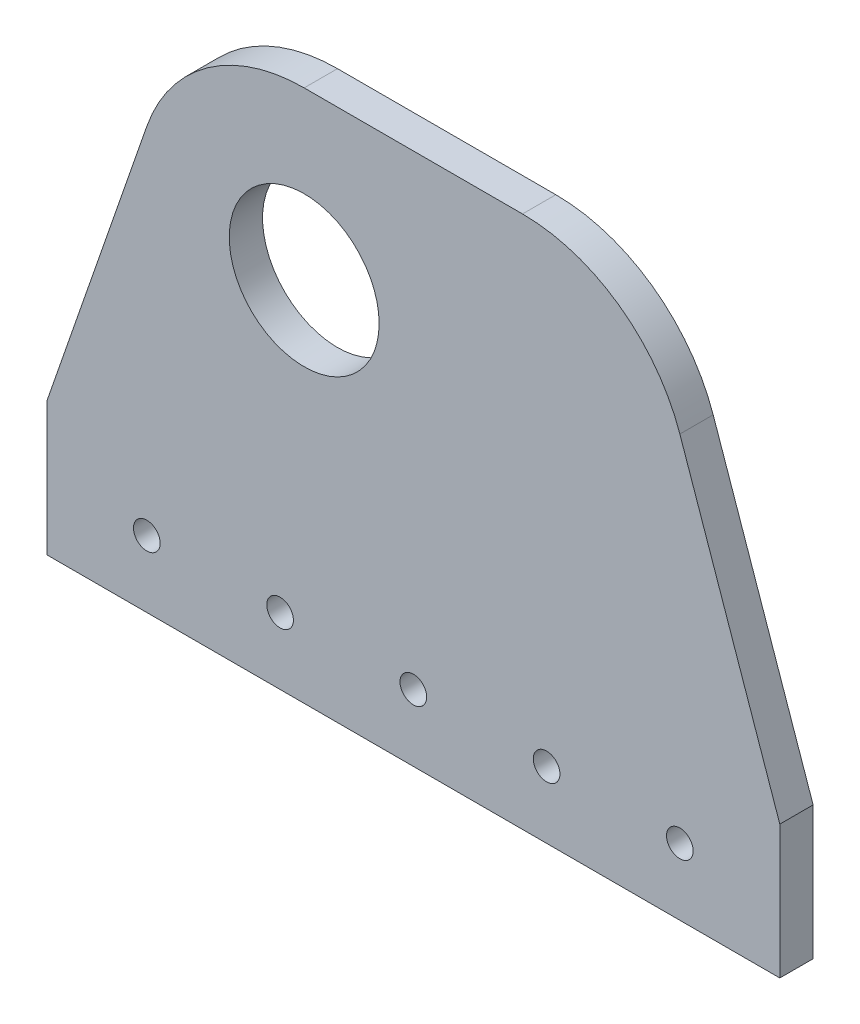
ISO-10303-21;
HEADER;
FILE_DESCRIPTION(('STEP AP214'),'2;1');
FILE_NAME('part.step','',(''),(''),'','','');
FILE_SCHEMA(('AUTOMOTIVE_DESIGN { 1 0 10303 214 1 1 1 1 }'));
ENDSEC;
DATA;
#1=APPLICATION_CONTEXT('core data for automotive mechanical design processes');
#2=APPLICATION_PROTOCOL_DEFINITION('international standard','automotive_design',2000,#1);
#3=PRODUCT_CONTEXT('',#1,'mechanical');
#4=PRODUCT('Part','Part','',(#3));
#5=PRODUCT_RELATED_PRODUCT_CATEGORY('part','',(#4));
#6=PRODUCT_DEFINITION_FORMATION('','',#4);
#7=PRODUCT_DEFINITION_CONTEXT('part definition',#1,'design');
#8=PRODUCT_DEFINITION('design','',#6,#7);
#9=PRODUCT_DEFINITION_SHAPE('','',#8);
#10=(LENGTH_UNIT() NAMED_UNIT(*) SI_UNIT(.MILLI.,.METRE.));
#11=(NAMED_UNIT(*) PLANE_ANGLE_UNIT() SI_UNIT($,.RADIAN.));
#12=(NAMED_UNIT(*) SI_UNIT($,.STERADIAN.) SOLID_ANGLE_UNIT());
#13=UNCERTAINTY_MEASURE_WITH_UNIT(LENGTH_MEASURE(1.E-05),#10,'distance_accuracy_value','');
#14=(GEOMETRIC_REPRESENTATION_CONTEXT(3) GLOBAL_UNCERTAINTY_ASSIGNED_CONTEXT((#13)) GLOBAL_UNIT_ASSIGNED_CONTEXT((#10,
#11,#12)) REPRESENTATION_CONTEXT('',''));
#15=CARTESIAN_POINT('',(0.,0.,0.));
#16=DIRECTION('',(0.,0.,1.));
#17=DIRECTION('',(1.,0.,0.));
#18=AXIS2_PLACEMENT_3D('',#15,#16,#17);
#19=CARTESIAN_POINT('',(49.0434075063098,69.85,6.35));
#20=DIRECTION('',(0.,0.,1.));
#21=DIRECTION('',(1.,0.,0.));
#22=AXIS2_PLACEMENT_3D('',#19,#20,#21);
#23=PLANE('',#22);
#24=CARTESIAN_POINT('',(44.45,12.6999999999998,6.35));
#25=DIRECTION('',(0.,0.,1.));
#26=DIRECTION('',(1.,0.,0.));
#27=AXIS2_PLACEMENT_3D('',#24,#25,#26);
#28=CIRCLE('',#27,2.54);
#29=CARTESIAN_POINT('',(46.99,12.6999999999998,6.35));
#30=VERTEX_POINT('',#29);
#31=EDGE_CURVE('E203',#30,#30,#28,.T.);
#32=ORIENTED_EDGE('',*,*,#31,.F.);
#33=EDGE_LOOP('',(#32));
#34=FACE_BOUND('',#33,.T.);
#35=CARTESIAN_POINT('',(95.25,12.7,6.35));
#36=DIRECTION('',(0.,0.,1.));
#37=DIRECTION('',(1.,0.,0.));
#38=AXIS2_PLACEMENT_3D('',#35,#36,#37);
#39=CIRCLE('',#38,2.53999999999998);
#40=CARTESIAN_POINT('',(97.79,12.7,6.35));
#41=VERTEX_POINT('',#40);
#42=EDGE_CURVE('E191',#41,#41,#39,.T.);
#43=ORIENTED_EDGE('',*,*,#42,.F.);
#44=EDGE_LOOP('',(#43));
#45=FACE_BOUND('',#44,.T.);
#46=CARTESIAN_POINT('',(49.0434075063098,69.85,6.35));
#47=DIRECTION('',(0.,0.,1.));
#48=DIRECTION('',(1.,0.,0.));
#49=AXIS2_PLACEMENT_3D('',#46,#47,#48);
#50=CIRCLE('',#49,14.2875);
#51=CARTESIAN_POINT('',(63.3309075063098,69.85,6.35));
#52=VERTEX_POINT('',#51);
#53=EDGE_CURVE('E137',#52,#52,#50,.T.);
#54=ORIENTED_EDGE('',*,*,#53,.F.);
#55=EDGE_LOOP('',(#54));
#56=FACE_BOUND('',#55,.T.);
#57=DIRECTION('',(0.,-1.,0.));
#58=VECTOR('',#57,1.);
#59=CARTESIAN_POINT('',(0.,0.,6.35));
#60=LINE('',#59,#58);
#61=CARTESIAN_POINT('',(0.,25.4,6.35));
#62=VERTEX_POINT('',#61);
#63=CARTESIAN_POINT('',(0.,0.,6.35));
#64=VERTEX_POINT('',#63);
#65=EDGE_CURVE('E148',#62,#64,#60,.T.);
#66=ORIENTED_EDGE('',*,*,#65,.T.);
#67=DIRECTION('',(1.,0.,0.));
#68=VECTOR('',#67,1.);
#69=CARTESIAN_POINT('',(139.7,0.,6.35));
#70=LINE('',#69,#68);
#71=CARTESIAN_POINT('',(139.7,0.,6.35));
#72=VERTEX_POINT('',#71);
#73=EDGE_CURVE('E96',#64,#72,#70,.T.);
#74=ORIENTED_EDGE('',*,*,#73,.T.);
#75=DIRECTION('',(0.,1.,0.));
#76=VECTOR('',#75,1.);
#77=CARTESIAN_POINT('',(139.7,25.4,6.35));
#78=LINE('',#77,#76);
#79=CARTESIAN_POINT('',(139.7,25.4,6.35));
#80=VERTEX_POINT('',#79);
#81=EDGE_CURVE('E163',#72,#80,#78,.T.);
#82=ORIENTED_EDGE('',*,*,#81,.T.);
#83=DIRECTION('',(-0.328009995720053,0.944674252167238,0.));
#84=VECTOR('',#83,1.);
#85=CARTESIAN_POINT('',(120.65,80.2643173641117,6.35));
#86=LINE('',#85,#84);
#87=CARTESIAN_POINT('',(120.65,80.2643173641117,6.35));
#88=VERTEX_POINT('',#87);
#89=EDGE_CURVE('E176',#80,#88,#86,.T.);
#90=ORIENTED_EDGE('',*,*,#89,.T.);
#91=CARTESIAN_POINT('',(90.6565924936902,69.85,6.35));
#92=DIRECTION('',(0.,0.,1.));
#93=DIRECTION('',(1.,0.,0.));
#94=AXIS2_PLACEMENT_3D('',#91,#92,#93);
#95=CIRCLE('',#94,31.75);
#96=CARTESIAN_POINT('',(90.6565924936902,101.6,6.35));
#97=VERTEX_POINT('',#96);
#98=EDGE_CURVE('E115',#88,#97,#95,.T.);
#99=ORIENTED_EDGE('',*,*,#98,.T.);
#100=DIRECTION('',(-1.,0.,0.));
#101=VECTOR('',#100,1.);
#102=CARTESIAN_POINT('',(49.0434075063098,101.6,6.35));
#103=LINE('',#102,#101);
#104=CARTESIAN_POINT('',(49.0434075063098,101.6,6.35));
#105=VERTEX_POINT('',#104);
#106=EDGE_CURVE('E109',#97,#105,#103,.T.);
#107=ORIENTED_EDGE('',*,*,#106,.T.);
#108=CARTESIAN_POINT('',(49.0434075063098,69.85,6.35));
#109=DIRECTION('',(0.,0.,1.));
#110=DIRECTION('',(1.,0.,0.));
#111=AXIS2_PLACEMENT_3D('',#108,#109,#110);
#112=CIRCLE('',#111,31.75);
#113=CARTESIAN_POINT('',(19.05,80.2643173641117,6.35));
#114=VERTEX_POINT('',#113);
#115=EDGE_CURVE('E113',#105,#114,#112,.T.);
#116=ORIENTED_EDGE('',*,*,#115,.T.);
#117=DIRECTION('',(-0.328009995720053,-0.944674252167238,0.));
#118=VECTOR('',#117,1.);
#119=CARTESIAN_POINT('',(0.,25.4,6.35));
#120=LINE('',#119,#118);
#121=EDGE_CURVE('E53',#114,#62,#120,.T.);
#122=ORIENTED_EDGE('',*,*,#121,.T.);
#123=EDGE_LOOP('',(#66,#74,#82,#90,#99,#107,#116,#122));
#124=FACE_BOUND('',#123,.T.);
#125=CARTESIAN_POINT('',(69.85,12.7,6.35));
#126=DIRECTION('',(0.,0.,1.));
#127=DIRECTION('',(1.,0.,0.));
#128=AXIS2_PLACEMENT_3D('',#125,#126,#127);
#129=CIRCLE('',#128,2.54);
#130=CARTESIAN_POINT('',(72.39,12.7,6.35));
#131=VERTEX_POINT('',#130);
#132=EDGE_CURVE('E185',#131,#131,#129,.T.);
#133=ORIENTED_EDGE('',*,*,#132,.F.);
#134=EDGE_LOOP('',(#133));
#135=FACE_BOUND('',#134,.T.);
#136=CARTESIAN_POINT('',(120.65,12.7,6.35));
#137=DIRECTION('',(0.,0.,1.));
#138=DIRECTION('',(1.,0.,0.));
#139=AXIS2_PLACEMENT_3D('',#136,#137,#138);
#140=CIRCLE('',#139,2.54);
#141=CARTESIAN_POINT('',(123.19,12.7,6.35));
#142=VERTEX_POINT('',#141);
#143=EDGE_CURVE('E197',#142,#142,#140,.T.);
#144=ORIENTED_EDGE('',*,*,#143,.F.);
#145=EDGE_LOOP('',(#144));
#146=FACE_BOUND('',#145,.T.);
#147=CARTESIAN_POINT('',(19.05,12.6999999999996,6.35));
#148=DIRECTION('',(0.,0.,1.));
#149=DIRECTION('',(1.,0.,0.));
#150=AXIS2_PLACEMENT_3D('',#147,#148,#149);
#151=CIRCLE('',#150,2.54);
#152=CARTESIAN_POINT('',(21.59,12.6999999999996,6.35));
#153=VERTEX_POINT('',#152);
#154=EDGE_CURVE('E209',#153,#153,#151,.T.);
#155=ORIENTED_EDGE('',*,*,#154,.F.);
#156=EDGE_LOOP('',(#155));
#157=FACE_BOUND('',#156,.T.);
#158=ADVANCED_FACE('F36',(#34,#45,#56,#124,#135,#146,#157),#23,.T.);
#159=CARTESIAN_POINT('',(49.0434075063098,69.85,0.));
#160=DIRECTION('',(0.,0.,1.));
#161=DIRECTION('',(1.,0.,0.));
#162=AXIS2_PLACEMENT_3D('',#159,#160,#161);
#163=PLANE('',#162);
#164=DIRECTION('',(0.,-1.,0.));
#165=VECTOR('',#164,1.);
#166=CARTESIAN_POINT('',(0.,0.,0.));
#167=LINE('',#166,#165);
#168=CARTESIAN_POINT('',(0.,25.4,0.));
#169=VERTEX_POINT('',#168);
#170=CARTESIAN_POINT('',(0.,0.,0.));
#171=VERTEX_POINT('',#170);
#172=EDGE_CURVE('E133',#169,#171,#167,.T.);
#173=ORIENTED_EDGE('',*,*,#172,.F.);
#174=DIRECTION('',(-0.328009995720053,-0.944674252167238,0.));
#175=VECTOR('',#174,1.);
#176=CARTESIAN_POINT('',(0.,25.4,0.));
#177=LINE('',#176,#175);
#178=CARTESIAN_POINT('',(19.05,80.2643173641117,0.));
#179=VERTEX_POINT('',#178);
#180=EDGE_CURVE('E88',#179,#169,#177,.T.);
#181=ORIENTED_EDGE('',*,*,#180,.F.);
#182=CARTESIAN_POINT('',(49.0434075063098,69.85,0.));
#183=DIRECTION('',(0.,0.,1.));
#184=DIRECTION('',(1.,0.,0.));
#185=AXIS2_PLACEMENT_3D('',#182,#183,#184);
#186=CIRCLE('',#185,31.75);
#187=CARTESIAN_POINT('',(49.0434075063098,101.6,0.));
#188=VERTEX_POINT('',#187);
#189=EDGE_CURVE('E82',#188,#179,#186,.T.);
#190=ORIENTED_EDGE('',*,*,#189,.F.);
#191=DIRECTION('',(-1.,0.,0.));
#192=VECTOR('',#191,1.);
#193=CARTESIAN_POINT('',(49.0434075063098,101.6,0.));
#194=LINE('',#193,#192);
#195=CARTESIAN_POINT('',(90.6565924936902,101.6,0.));
#196=VERTEX_POINT('',#195);
#197=EDGE_CURVE('E123',#196,#188,#194,.T.);
#198=ORIENTED_EDGE('',*,*,#197,.F.);
#199=CARTESIAN_POINT('',(90.6565924936902,69.85,0.));
#200=DIRECTION('',(0.,0.,1.));
#201=DIRECTION('',(1.,0.,0.));
#202=AXIS2_PLACEMENT_3D('',#199,#200,#201);
#203=CIRCLE('',#202,31.75);
#204=CARTESIAN_POINT('',(120.65,80.2643173641117,0.));
#205=VERTEX_POINT('',#204);
#206=EDGE_CURVE('E143',#205,#196,#203,.T.);
#207=ORIENTED_EDGE('',*,*,#206,.F.);
#208=DIRECTION('',(-0.328009995720053,0.944674252167238,0.));
#209=VECTOR('',#208,1.);
#210=CARTESIAN_POINT('',(120.65,80.2643173641117,0.));
#211=LINE('',#210,#209);
#212=CARTESIAN_POINT('',(139.7,25.4,0.));
#213=VERTEX_POINT('',#212);
#214=EDGE_CURVE('E141',#213,#205,#211,.T.);
#215=ORIENTED_EDGE('',*,*,#214,.F.);
#216=DIRECTION('',(0.,1.,0.));
#217=VECTOR('',#216,1.);
#218=CARTESIAN_POINT('',(139.7,25.4,0.));
#219=LINE('',#218,#217);
#220=CARTESIAN_POINT('',(139.7,0.,0.));
#221=VERTEX_POINT('',#220);
#222=EDGE_CURVE('E139',#221,#213,#219,.T.);
#223=ORIENTED_EDGE('',*,*,#222,.F.);
#224=DIRECTION('',(1.,0.,0.));
#225=VECTOR('',#224,1.);
#226=CARTESIAN_POINT('',(139.7,0.,0.));
#227=LINE('',#226,#225);
#228=EDGE_CURVE('E136',#171,#221,#227,.T.);
#229=ORIENTED_EDGE('',*,*,#228,.F.);
#230=EDGE_LOOP('',(#173,#181,#190,#198,#207,#215,#223,#229));
#231=FACE_BOUND('',#230,.T.);
#232=CARTESIAN_POINT('',(49.0434075063098,69.85,0.));
#233=DIRECTION('',(0.,0.,1.));
#234=DIRECTION('',(1.,0.,0.));
#235=AXIS2_PLACEMENT_3D('',#232,#233,#234);
#236=CIRCLE('',#235,14.2875);
#237=CARTESIAN_POINT('',(63.3309075063098,69.85,0.));
#238=VERTEX_POINT('',#237);
#239=EDGE_CURVE('E182',#238,#238,#236,.T.);
#240=ORIENTED_EDGE('',*,*,#239,.T.);
#241=EDGE_LOOP('',(#240));
#242=FACE_BOUND('',#241,.T.);
#243=CARTESIAN_POINT('',(69.85,12.7,0.));
#244=DIRECTION('',(0.,0.,1.));
#245=DIRECTION('',(1.,0.,0.));
#246=AXIS2_PLACEMENT_3D('',#243,#244,#245);
#247=CIRCLE('',#246,2.54);
#248=CARTESIAN_POINT('',(72.39,12.7,0.));
#249=VERTEX_POINT('',#248);
#250=EDGE_CURVE('E188',#249,#249,#247,.T.);
#251=ORIENTED_EDGE('',*,*,#250,.T.);
#252=EDGE_LOOP('',(#251));
#253=FACE_BOUND('',#252,.T.);
#254=CARTESIAN_POINT('',(95.25,12.7,0.));
#255=DIRECTION('',(0.,0.,1.));
#256=DIRECTION('',(1.,0.,0.));
#257=AXIS2_PLACEMENT_3D('',#254,#255,#256);
#258=CIRCLE('',#257,2.53999999999998);
#259=CARTESIAN_POINT('',(97.79,12.7,0.));
#260=VERTEX_POINT('',#259);
#261=EDGE_CURVE('E194',#260,#260,#258,.T.);
#262=ORIENTED_EDGE('',*,*,#261,.T.);
#263=EDGE_LOOP('',(#262));
#264=FACE_BOUND('',#263,.T.);
#265=CARTESIAN_POINT('',(120.65,12.7,0.));
#266=DIRECTION('',(0.,0.,1.));
#267=DIRECTION('',(1.,0.,0.));
#268=AXIS2_PLACEMENT_3D('',#265,#266,#267);
#269=CIRCLE('',#268,2.54);
#270=CARTESIAN_POINT('',(123.19,12.7,0.));
#271=VERTEX_POINT('',#270);
#272=EDGE_CURVE('E200',#271,#271,#269,.T.);
#273=ORIENTED_EDGE('',*,*,#272,.T.);
#274=EDGE_LOOP('',(#273));
#275=FACE_BOUND('',#274,.T.);
#276=CARTESIAN_POINT('',(44.45,12.6999999999998,0.));
#277=DIRECTION('',(0.,0.,1.));
#278=DIRECTION('',(1.,0.,0.));
#279=AXIS2_PLACEMENT_3D('',#276,#277,#278);
#280=CIRCLE('',#279,2.54);
#281=CARTESIAN_POINT('',(46.99,12.6999999999998,0.));
#282=VERTEX_POINT('',#281);
#283=EDGE_CURVE('E206',#282,#282,#280,.T.);
#284=ORIENTED_EDGE('',*,*,#283,.T.);
#285=EDGE_LOOP('',(#284));
#286=FACE_BOUND('',#285,.T.);
#287=CARTESIAN_POINT('',(19.05,12.6999999999996,0.));
#288=DIRECTION('',(0.,0.,1.));
#289=DIRECTION('',(1.,0.,0.));
#290=AXIS2_PLACEMENT_3D('',#287,#288,#289);
#291=CIRCLE('',#290,2.54);
#292=CARTESIAN_POINT('',(21.59,12.6999999999996,0.));
#293=VERTEX_POINT('',#292);
#294=EDGE_CURVE('E212',#293,#293,#291,.T.);
#295=ORIENTED_EDGE('',*,*,#294,.T.);
#296=EDGE_LOOP('',(#295));
#297=FACE_BOUND('',#296,.T.);
#298=ADVANCED_FACE('F167',(#231,#242,#253,#264,#275,#286,#297),#163,.F.);
#299=CARTESIAN_POINT('',(0.,0.,6.35));
#300=DIRECTION('',(1.,0.,0.));
#301=DIRECTION('',(0.,0.,-1.));
#302=AXIS2_PLACEMENT_3D('',#299,#300,#301);
#303=PLANE('',#302);
#304=ORIENTED_EDGE('',*,*,#172,.T.);
#305=DIRECTION('',(0.,0.,-1.));
#306=VECTOR('',#305,1.);
#307=CARTESIAN_POINT('',(0.,0.,6.35));
#308=LINE('',#307,#306);
#309=EDGE_CURVE('E11',#64,#171,#308,.T.);
#310=ORIENTED_EDGE('',*,*,#309,.F.);
#311=ORIENTED_EDGE('',*,*,#65,.F.);
#312=DIRECTION('',(0.,0.,-1.));
#313=VECTOR('',#312,1.);
#314=CARTESIAN_POINT('',(0.,25.4,6.35));
#315=LINE('',#314,#313);
#316=EDGE_CURVE('E129',#62,#169,#315,.T.);
#317=ORIENTED_EDGE('',*,*,#316,.T.);
#318=EDGE_LOOP('',(#304,#310,#311,#317));
#319=FACE_BOUND('',#318,.T.);
#320=ADVANCED_FACE('F38',(#319),#303,.F.);
#321=CARTESIAN_POINT('',(139.7,0.,6.35));
#322=DIRECTION('',(0.,1.,0.));
#323=DIRECTION('',(-1.,0.,0.));
#324=AXIS2_PLACEMENT_3D('',#321,#322,#323);
#325=PLANE('',#324);
#326=ORIENTED_EDGE('',*,*,#228,.T.);
#327=DIRECTION('',(0.,0.,-1.));
#328=VECTOR('',#327,1.);
#329=CARTESIAN_POINT('',(139.7,0.,6.35));
#330=LINE('',#329,#328);
#331=EDGE_CURVE('E45',#72,#221,#330,.T.);
#332=ORIENTED_EDGE('',*,*,#331,.F.);
#333=ORIENTED_EDGE('',*,*,#73,.F.);
#334=ORIENTED_EDGE('',*,*,#309,.T.);
#335=EDGE_LOOP('',(#326,#332,#333,#334));
#336=FACE_BOUND('',#335,.T.);
#337=ADVANCED_FACE('F246',(#336),#325,.F.);
#338=CARTESIAN_POINT('',(139.7,25.4,6.35));
#339=DIRECTION('',(-1.,0.,0.));
#340=DIRECTION('',(0.,0.,1.));
#341=AXIS2_PLACEMENT_3D('',#338,#339,#340);
#342=PLANE('',#341);
#343=ORIENTED_EDGE('',*,*,#222,.T.);
#344=DIRECTION('',(0.,0.,-1.));
#345=VECTOR('',#344,1.);
#346=CARTESIAN_POINT('',(139.7,25.4,6.35));
#347=LINE('',#346,#345);
#348=EDGE_CURVE('E155',#80,#213,#347,.T.);
#349=ORIENTED_EDGE('',*,*,#348,.F.);
#350=ORIENTED_EDGE('',*,*,#81,.F.);
#351=ORIENTED_EDGE('',*,*,#331,.T.);
#352=EDGE_LOOP('',(#343,#349,#350,#351));
#353=FACE_BOUND('',#352,.T.);
#354=ADVANCED_FACE('F161',(#353),#342,.F.);
#355=CARTESIAN_POINT('',(120.65,80.2643173641117,6.35));
#356=DIRECTION('',(-0.944674252167238,-0.328009995720053,0.));
#357=DIRECTION('',(0.328009995720053,-0.944674252167238,0.));
#358=AXIS2_PLACEMENT_3D('',#355,#356,#357);
#359=PLANE('',#358);
#360=ORIENTED_EDGE('',*,*,#214,.T.);
#361=DIRECTION('',(0.,0.,-1.));
#362=VECTOR('',#361,1.);
#363=CARTESIAN_POINT('',(120.65,80.2643173641117,6.35));
#364=LINE('',#363,#362);
#365=EDGE_CURVE('E152',#88,#205,#364,.T.);
#366=ORIENTED_EDGE('',*,*,#365,.F.);
#367=ORIENTED_EDGE('',*,*,#89,.F.);
#368=ORIENTED_EDGE('',*,*,#348,.T.);
#369=EDGE_LOOP('',(#360,#366,#367,#368));
#370=FACE_BOUND('',#369,.T.);
#371=ADVANCED_FACE('F172',(#370),#359,.F.);
#372=CARTESIAN_POINT('',(90.6565924936902,69.85,6.35));
#373=DIRECTION('',(0.,0.,-1.));
#374=DIRECTION('',(-1.,0.,0.));
#375=AXIS2_PLACEMENT_3D('',#372,#373,#374);
#376=CYLINDRICAL_SURFACE('',#375,31.75);
#377=ORIENTED_EDGE('',*,*,#206,.T.);
#378=DIRECTION('',(0.,0.,-1.));
#379=VECTOR('',#378,1.);
#380=CARTESIAN_POINT('',(90.6565924936902,101.6,6.35));
#381=LINE('',#380,#379);
#382=EDGE_CURVE('E124',#97,#196,#381,.T.);
#383=ORIENTED_EDGE('',*,*,#382,.F.);
#384=ORIENTED_EDGE('',*,*,#98,.F.);
#385=ORIENTED_EDGE('',*,*,#365,.T.);
#386=EDGE_LOOP('',(#377,#383,#384,#385));
#387=FACE_BOUND('',#386,.T.);
#388=ADVANCED_FACE('F175',(#387),#376,.T.);
#389=CARTESIAN_POINT('',(49.0434075063098,101.6,6.35));
#390=DIRECTION('',(0.,-1.,0.));
#391=DIRECTION('',(1.,0.,0.));
#392=AXIS2_PLACEMENT_3D('',#389,#390,#391);
#393=PLANE('',#392);
#394=ORIENTED_EDGE('',*,*,#197,.T.);
#395=DIRECTION('',(0.,0.,-1.));
#396=VECTOR('',#395,1.);
#397=CARTESIAN_POINT('',(49.0434075063098,101.6,6.35));
#398=LINE('',#397,#396);
#399=EDGE_CURVE('E120',#105,#188,#398,.T.);
#400=ORIENTED_EDGE('',*,*,#399,.F.);
#401=ORIENTED_EDGE('',*,*,#106,.F.);
#402=ORIENTED_EDGE('',*,*,#382,.T.);
#403=EDGE_LOOP('',(#394,#400,#401,#402));
#404=FACE_BOUND('',#403,.T.);
#405=ADVANCED_FACE('F121',(#404),#393,.F.);
#406=CARTESIAN_POINT('',(49.0434075063098,69.85,6.35));
#407=DIRECTION('',(0.,0.,-1.));
#408=DIRECTION('',(-1.,0.,0.));
#409=AXIS2_PLACEMENT_3D('',#406,#407,#408);
#410=CYLINDRICAL_SURFACE('',#409,31.75);
#411=ORIENTED_EDGE('',*,*,#189,.T.);
#412=DIRECTION('',(0.,0.,-1.));
#413=VECTOR('',#412,1.);
#414=CARTESIAN_POINT('',(19.05,80.2643173641117,6.35));
#415=LINE('',#414,#413);
#416=EDGE_CURVE('E125',#114,#179,#415,.T.);
#417=ORIENTED_EDGE('',*,*,#416,.F.);
#418=ORIENTED_EDGE('',*,*,#115,.F.);
#419=ORIENTED_EDGE('',*,*,#399,.T.);
#420=EDGE_LOOP('',(#411,#417,#418,#419));
#421=FACE_BOUND('',#420,.T.);
#422=ADVANCED_FACE('F127',(#421),#410,.T.);
#423=CARTESIAN_POINT('',(0.,25.4,6.35));
#424=DIRECTION('',(0.944674252167238,-0.328009995720053,0.));
#425=DIRECTION('',(0.328009995720053,0.944674252167238,0.));
#426=AXIS2_PLACEMENT_3D('',#423,#424,#425);
#427=PLANE('',#426);
#428=ORIENTED_EDGE('',*,*,#180,.T.);
#429=ORIENTED_EDGE('',*,*,#316,.F.);
#430=ORIENTED_EDGE('',*,*,#121,.F.);
#431=ORIENTED_EDGE('',*,*,#416,.T.);
#432=EDGE_LOOP('',(#428,#429,#430,#431));
#433=FACE_BOUND('',#432,.T.);
#434=ADVANCED_FACE('F234',(#433),#427,.F.);
#435=CARTESIAN_POINT('',(49.0434075063098,69.85,6.35));
#436=DIRECTION('',(0.,0.,-1.));
#437=DIRECTION('',(-1.,0.,0.));
#438=AXIS2_PLACEMENT_3D('',#435,#436,#437);
#439=CYLINDRICAL_SURFACE('',#438,14.2875);
#440=ORIENTED_EDGE('',*,*,#53,.T.);
#441=EDGE_LOOP('',(#440));
#442=FACE_BOUND('',#441,.T.);
#443=ORIENTED_EDGE('',*,*,#239,.F.);
#444=EDGE_LOOP('',(#443));
#445=FACE_BOUND('',#444,.T.);
#446=ADVANCED_FACE('F231',(#442,#445),#439,.F.);
#447=CARTESIAN_POINT('',(69.85,12.7,6.35));
#448=DIRECTION('',(0.,0.,-1.));
#449=DIRECTION('',(-1.,0.,0.));
#450=AXIS2_PLACEMENT_3D('',#447,#448,#449);
#451=CYLINDRICAL_SURFACE('',#450,2.54);
#452=ORIENTED_EDGE('',*,*,#132,.T.);
#453=EDGE_LOOP('',(#452));
#454=FACE_BOUND('',#453,.T.);
#455=ORIENTED_EDGE('',*,*,#250,.F.);
#456=EDGE_LOOP('',(#455));
#457=FACE_BOUND('',#456,.T.);
#458=ADVANCED_FACE('F310',(#454,#457),#451,.F.);
#459=CARTESIAN_POINT('',(95.25,12.7,6.35));
#460=DIRECTION('',(0.,0.,-1.));
#461=DIRECTION('',(-1.,0.,0.));
#462=AXIS2_PLACEMENT_3D('',#459,#460,#461);
#463=CYLINDRICAL_SURFACE('',#462,2.53999999999998);
#464=ORIENTED_EDGE('',*,*,#42,.T.);
#465=EDGE_LOOP('',(#464));
#466=FACE_BOUND('',#465,.T.);
#467=ORIENTED_EDGE('',*,*,#261,.F.);
#468=EDGE_LOOP('',(#467));
#469=FACE_BOUND('',#468,.T.);
#470=ADVANCED_FACE('F318',(#466,#469),#463,.F.);
#471=CARTESIAN_POINT('',(120.65,12.7,6.35));
#472=DIRECTION('',(0.,0.,-1.));
#473=DIRECTION('',(-1.,0.,0.));
#474=AXIS2_PLACEMENT_3D('',#471,#472,#473);
#475=CYLINDRICAL_SURFACE('',#474,2.54);
#476=ORIENTED_EDGE('',*,*,#143,.T.);
#477=EDGE_LOOP('',(#476));
#478=FACE_BOUND('',#477,.T.);
#479=ORIENTED_EDGE('',*,*,#272,.F.);
#480=EDGE_LOOP('',(#479));
#481=FACE_BOUND('',#480,.T.);
#482=ADVANCED_FACE('F326',(#478,#481),#475,.F.);
#483=CARTESIAN_POINT('',(44.45,12.6999999999998,6.35));
#484=DIRECTION('',(0.,0.,-1.));
#485=DIRECTION('',(-1.,0.,0.));
#486=AXIS2_PLACEMENT_3D('',#483,#484,#485);
#487=CYLINDRICAL_SURFACE('',#486,2.54);
#488=ORIENTED_EDGE('',*,*,#31,.T.);
#489=EDGE_LOOP('',(#488));
#490=FACE_BOUND('',#489,.T.);
#491=ORIENTED_EDGE('',*,*,#283,.F.);
#492=EDGE_LOOP('',(#491));
#493=FACE_BOUND('',#492,.T.);
#494=ADVANCED_FACE('F335',(#490,#493),#487,.F.);
#495=CARTESIAN_POINT('',(19.05,12.6999999999996,6.35));
#496=DIRECTION('',(0.,0.,-1.));
#497=DIRECTION('',(-1.,0.,0.));
#498=AXIS2_PLACEMENT_3D('',#495,#496,#497);
#499=CYLINDRICAL_SURFACE('',#498,2.54);
#500=ORIENTED_EDGE('',*,*,#154,.T.);
#501=EDGE_LOOP('',(#500));
#502=FACE_BOUND('',#501,.T.);
#503=ORIENTED_EDGE('',*,*,#294,.F.);
#504=EDGE_LOOP('',(#503));
#505=FACE_BOUND('',#504,.T.);
#506=ADVANCED_FACE('F218',(#502,#505),#499,.F.);
#507=CLOSED_SHELL('',(#158,#298,#320,#337,#354,#371,#388,#405,#422,#434,#446,#458,#470,#482,
#494,#506));
#508=MANIFOLD_SOLID_BREP('B2',#507);
#509=ADVANCED_BREP_SHAPE_REPRESENTATION('',(#18,#508),#14);
#510=SHAPE_DEFINITION_REPRESENTATION(#9,#509);
ENDSEC;
END-ISO-10303-21;
